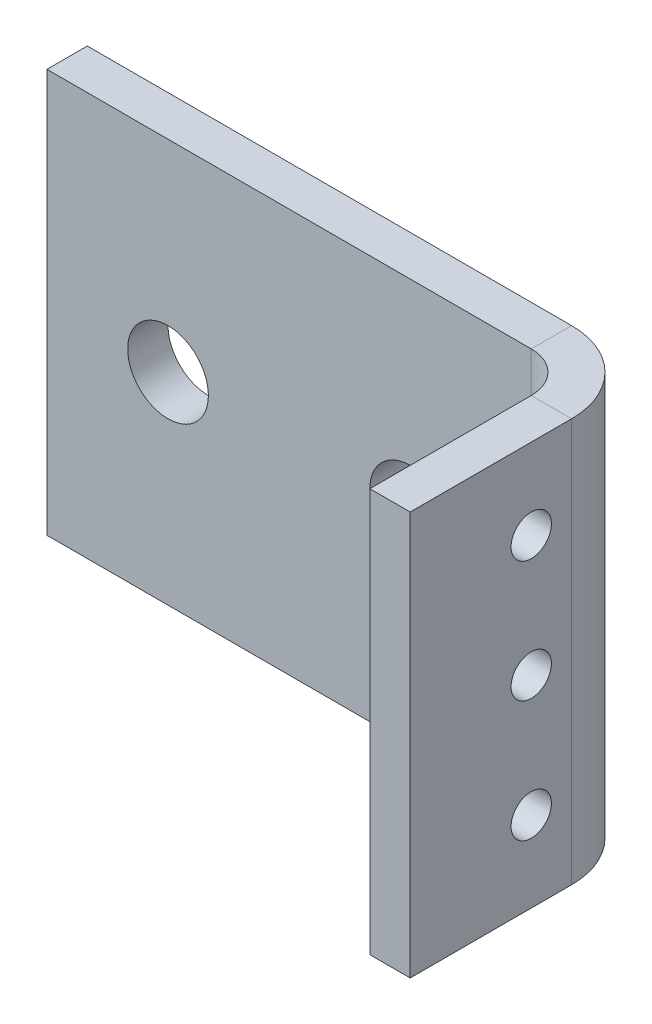
ISO-10303-21;
HEADER;
FILE_DESCRIPTION(('STEP AP214'),'2;1');
FILE_NAME('part.step','',(''),(''),'','','');
FILE_SCHEMA(('AUTOMOTIVE_DESIGN { 1 0 10303 214 1 1 1 1 }'));
ENDSEC;
DATA;
#1=APPLICATION_CONTEXT('core data for automotive mechanical design processes');
#2=APPLICATION_PROTOCOL_DEFINITION('international standard','automotive_design',2000,#1);
#3=PRODUCT_CONTEXT('',#1,'mechanical');
#4=PRODUCT('Part','Part','',(#3));
#5=PRODUCT_RELATED_PRODUCT_CATEGORY('part','',(#4));
#6=PRODUCT_DEFINITION_FORMATION('','',#4);
#7=PRODUCT_DEFINITION_CONTEXT('part definition',#1,'design');
#8=PRODUCT_DEFINITION('design','',#6,#7);
#9=PRODUCT_DEFINITION_SHAPE('','',#8);
#10=(LENGTH_UNIT() NAMED_UNIT(*) SI_UNIT(.MILLI.,.METRE.));
#11=(NAMED_UNIT(*) PLANE_ANGLE_UNIT() SI_UNIT($,.RADIAN.));
#12=(NAMED_UNIT(*) SI_UNIT($,.STERADIAN.) SOLID_ANGLE_UNIT());
#13=UNCERTAINTY_MEASURE_WITH_UNIT(LENGTH_MEASURE(1.E-05),#10,'distance_accuracy_value','');
#14=(GEOMETRIC_REPRESENTATION_CONTEXT(3) GLOBAL_UNCERTAINTY_ASSIGNED_CONTEXT((#13)) GLOBAL_UNIT_ASSIGNED_CONTEXT((#10,
#11,#12)) REPRESENTATION_CONTEXT('',''));
#15=CARTESIAN_POINT('',(0.,0.,0.));
#16=DIRECTION('',(0.,0.,1.));
#17=DIRECTION('',(1.,0.,0.));
#18=AXIS2_PLACEMENT_3D('',#15,#16,#17);
#19=CARTESIAN_POINT('',(-60.,-25.,-5.));
#20=DIRECTION('',(0.,-1.,0.));
#21=DIRECTION('',(0.,0.,-1.));
#22=AXIS2_PLACEMENT_3D('',#19,#20,#21);
#23=PLANE('',#22);
#24=DIRECTION('',(1.,0.,0.));
#25=VECTOR('',#24,1.);
#26=CARTESIAN_POINT('',(-60.,-25.,0.));
#27=LINE('',#26,#25);
#28=CARTESIAN_POINT('',(-60.,-25.,0.));
#29=VERTEX_POINT('',#28);
#30=CARTESIAN_POINT('',(0.,-25.,0.));
#31=VERTEX_POINT('',#30);
#32=EDGE_CURVE('E208',#29,#31,#27,.T.);
#33=ORIENTED_EDGE('',*,*,#32,.F.);
#34=DIRECTION('',(0.,0.,1.));
#35=VECTOR('',#34,1.);
#36=CARTESIAN_POINT('',(-60.,-25.,-5.));
#37=LINE('',#36,#35);
#38=CARTESIAN_POINT('',(-60.,-25.,-5.));
#39=VERTEX_POINT('',#38);
#40=EDGE_CURVE('E75',#39,#29,#37,.T.);
#41=ORIENTED_EDGE('',*,*,#40,.F.);
#42=DIRECTION('',(1.,0.,0.));
#43=VECTOR('',#42,1.);
#44=CARTESIAN_POINT('',(-60.,-25.,-5.));
#45=LINE('',#44,#43);
#46=CARTESIAN_POINT('',(0.,-25.,-5.));
#47=VERTEX_POINT('',#46);
#48=EDGE_CURVE('E213',#39,#47,#45,.T.);
#49=ORIENTED_EDGE('',*,*,#48,.T.);
#50=DIRECTION('',(0.,0.,1.));
#51=VECTOR('',#50,1.);
#52=CARTESIAN_POINT('',(0.,-25.,-5.));
#53=LINE('',#52,#51);
#54=EDGE_CURVE('E13',#47,#31,#53,.T.);
#55=ORIENTED_EDGE('',*,*,#54,.T.);
#56=EDGE_LOOP('',(#33,#41,#49,#55));
#57=FACE_BOUND('',#56,.T.);
#58=ADVANCED_FACE('F65',(#57),#23,.T.);
#59=CARTESIAN_POINT('',(-60.,25.,-5.));
#60=DIRECTION('',(-1.,0.,0.));
#61=DIRECTION('',(0.,-1.,0.));
#62=AXIS2_PLACEMENT_3D('',#59,#60,#61);
#63=PLANE('',#62);
#64=DIRECTION('',(0.,-1.,0.));
#65=VECTOR('',#64,1.);
#66=CARTESIAN_POINT('',(-60.,25.,0.));
#67=LINE('',#66,#65);
#68=CARTESIAN_POINT('',(-60.,25.,0.));
#69=VERTEX_POINT('',#68);
#70=EDGE_CURVE('E220',#69,#29,#67,.T.);
#71=ORIENTED_EDGE('',*,*,#70,.F.);
#72=DIRECTION('',(0.,0.,1.));
#73=VECTOR('',#72,1.);
#74=CARTESIAN_POINT('',(-60.,25.,-5.));
#75=LINE('',#74,#73);
#76=CARTESIAN_POINT('',(-60.,25.,-5.));
#77=VERTEX_POINT('',#76);
#78=EDGE_CURVE('E108',#77,#69,#75,.T.);
#79=ORIENTED_EDGE('',*,*,#78,.F.);
#80=DIRECTION('',(0.,-1.,0.));
#81=VECTOR('',#80,1.);
#82=CARTESIAN_POINT('',(-60.,25.,-5.));
#83=LINE('',#82,#81);
#84=EDGE_CURVE('E211',#77,#39,#83,.T.);
#85=ORIENTED_EDGE('',*,*,#84,.T.);
#86=ORIENTED_EDGE('',*,*,#40,.T.);
#87=EDGE_LOOP('',(#71,#79,#85,#86));
#88=FACE_BOUND('',#87,.T.);
#89=ADVANCED_FACE('F285',(#88),#63,.T.);
#90=CARTESIAN_POINT('',(-60.,25.,-5.));
#91=DIRECTION('',(0.,1.,0.));
#92=DIRECTION('',(-1.,0.,0.));
#93=AXIS2_PLACEMENT_3D('',#90,#91,#92);
#94=PLANE('',#93);
#95=DIRECTION('',(-1.,0.,0.));
#96=VECTOR('',#95,1.);
#97=CARTESIAN_POINT('',(-60.,25.,0.));
#98=LINE('',#97,#96);
#99=CARTESIAN_POINT('',(0.,25.,0.));
#100=VERTEX_POINT('',#99);
#101=EDGE_CURVE('E217',#100,#69,#98,.T.);
#102=ORIENTED_EDGE('',*,*,#101,.F.);
#103=DIRECTION('',(0.,0.,1.));
#104=VECTOR('',#103,1.);
#105=CARTESIAN_POINT('',(0.,25.,-5.));
#106=LINE('',#105,#104);
#107=CARTESIAN_POINT('',(0.,25.,-5.));
#108=VERTEX_POINT('',#107);
#109=EDGE_CURVE('E69',#108,#100,#106,.T.);
#110=ORIENTED_EDGE('',*,*,#109,.F.);
#111=DIRECTION('',(-1.,0.,0.));
#112=VECTOR('',#111,1.);
#113=CARTESIAN_POINT('',(-60.,25.,-5.));
#114=LINE('',#113,#112);
#115=EDGE_CURVE('E207',#108,#77,#114,.T.);
#116=ORIENTED_EDGE('',*,*,#115,.T.);
#117=ORIENTED_EDGE('',*,*,#78,.T.);
#118=EDGE_LOOP('',(#102,#110,#116,#117));
#119=FACE_BOUND('',#118,.T.);
#120=ADVANCED_FACE('F67',(#119),#94,.T.);
#121=CARTESIAN_POINT('',(0.,0.,-5.));
#122=DIRECTION('',(0.,0.,1.));
#123=DIRECTION('',(1.,0.,0.));
#124=AXIS2_PLACEMENT_3D('',#121,#122,#123);
#125=PLANE('',#124);
#126=CARTESIAN_POINT('',(-45.,0.,-5.));
#127=DIRECTION('',(0.,0.,1.));
#128=DIRECTION('',(1.,0.,0.));
#129=AXIS2_PLACEMENT_3D('',#126,#127,#128);
#130=CIRCLE('',#129,5.);
#131=CARTESIAN_POINT('',(-40.,0.,-5.));
#132=VERTEX_POINT('',#131);
#133=EDGE_CURVE('E194',#132,#132,#130,.T.);
#134=ORIENTED_EDGE('',*,*,#133,.T.);
#135=EDGE_LOOP('',(#134));
#136=FACE_BOUND('',#135,.T.);
#137=CARTESIAN_POINT('',(-15.,0.,-5.));
#138=DIRECTION('',(0.,0.,1.));
#139=DIRECTION('',(1.,0.,0.));
#140=AXIS2_PLACEMENT_3D('',#137,#138,#139);
#141=CIRCLE('',#140,5.);
#142=CARTESIAN_POINT('',(-10.,0.,-5.));
#143=VERTEX_POINT('',#142);
#144=EDGE_CURVE('E184',#143,#143,#141,.T.);
#145=ORIENTED_EDGE('',*,*,#144,.T.);
#146=EDGE_LOOP('',(#145));
#147=FACE_BOUND('',#146,.T.);
#148=DIRECTION('',(0.,1.,0.));
#149=VECTOR('',#148,1.);
#150=CARTESIAN_POINT('',(0.,25.,-5.));
#151=LINE('',#150,#149);
#152=EDGE_CURVE('E84',#47,#108,#151,.T.);
#153=ORIENTED_EDGE('',*,*,#152,.F.);
#154=ORIENTED_EDGE('',*,*,#48,.F.);
#155=ORIENTED_EDGE('',*,*,#84,.F.);
#156=ORIENTED_EDGE('',*,*,#115,.F.);
#157=EDGE_LOOP('',(#153,#154,#155,#156));
#158=FACE_BOUND('',#157,.T.);
#159=ADVANCED_FACE('F297',(#136,#147,#158),#125,.F.);
#160=CARTESIAN_POINT('',(0.,0.,0.));
#161=DIRECTION('',(0.,0.,1.));
#162=DIRECTION('',(1.,0.,0.));
#163=AXIS2_PLACEMENT_3D('',#160,#161,#162);
#164=PLANE('',#163);
#165=CARTESIAN_POINT('',(-45.,0.,0.));
#166=DIRECTION('',(0.,0.,1.));
#167=DIRECTION('',(1.,0.,0.));
#168=AXIS2_PLACEMENT_3D('',#165,#166,#167);
#169=CIRCLE('',#168,5.);
#170=CARTESIAN_POINT('',(-40.,0.,0.));
#171=VERTEX_POINT('',#170);
#172=EDGE_CURVE('E198',#171,#171,#169,.T.);
#173=ORIENTED_EDGE('',*,*,#172,.F.);
#174=EDGE_LOOP('',(#173));
#175=FACE_BOUND('',#174,.T.);
#176=CARTESIAN_POINT('',(-15.,0.,0.));
#177=DIRECTION('',(0.,0.,1.));
#178=DIRECTION('',(1.,0.,0.));
#179=AXIS2_PLACEMENT_3D('',#176,#177,#178);
#180=CIRCLE('',#179,5.);
#181=CARTESIAN_POINT('',(-10.,0.,0.));
#182=VERTEX_POINT('',#181);
#183=EDGE_CURVE('E201',#182,#182,#180,.T.);
#184=ORIENTED_EDGE('',*,*,#183,.F.);
#185=EDGE_LOOP('',(#184));
#186=FACE_BOUND('',#185,.T.);
#187=DIRECTION('',(0.,1.,0.));
#188=VECTOR('',#187,1.);
#189=CARTESIAN_POINT('',(0.,25.,0.));
#190=LINE('',#189,#188);
#191=EDGE_CURVE('E197',#31,#100,#190,.T.);
#192=ORIENTED_EDGE('',*,*,#191,.T.);
#193=ORIENTED_EDGE('',*,*,#101,.T.);
#194=ORIENTED_EDGE('',*,*,#70,.T.);
#195=ORIENTED_EDGE('',*,*,#32,.T.);
#196=EDGE_LOOP('',(#192,#193,#194,#195));
#197=FACE_BOUND('',#196,.T.);
#198=ADVANCED_FACE('F293',(#175,#186,#197),#164,.T.);
#199=CARTESIAN_POINT('',(-15.,0.,-5.));
#200=DIRECTION('',(0.,0.,1.));
#201=DIRECTION('',(1.,0.,0.));
#202=AXIS2_PLACEMENT_3D('',#199,#200,#201);
#203=CYLINDRICAL_SURFACE('',#202,5.);
#204=ORIENTED_EDGE('',*,*,#144,.F.);
#205=EDGE_LOOP('',(#204));
#206=FACE_BOUND('',#205,.T.);
#207=ORIENTED_EDGE('',*,*,#183,.T.);
#208=EDGE_LOOP('',(#207));
#209=FACE_BOUND('',#208,.T.);
#210=ADVANCED_FACE('F296',(#206,#209),#203,.F.);
#211=CARTESIAN_POINT('',(-45.,0.,-5.));
#212=DIRECTION('',(0.,0.,1.));
#213=DIRECTION('',(1.,0.,0.));
#214=AXIS2_PLACEMENT_3D('',#211,#212,#213);
#215=CYLINDRICAL_SURFACE('',#214,5.);
#216=ORIENTED_EDGE('',*,*,#133,.F.);
#217=EDGE_LOOP('',(#216));
#218=FACE_BOUND('',#217,.T.);
#219=ORIENTED_EDGE('',*,*,#172,.T.);
#220=EDGE_LOOP('',(#219));
#221=FACE_BOUND('',#220,.T.);
#222=ADVANCED_FACE('F304',(#218,#221),#215,.F.);
#223=CARTESIAN_POINT('',(0.,-25.,5.));
#224=DIRECTION('',(0.,-1.,0.));
#225=DIRECTION('',(1.,0.,0.));
#226=AXIS2_PLACEMENT_3D('',#223,#224,#225);
#227=PLANE('',#226);
#228=DIRECTION('',(-1.,0.,0.));
#229=VECTOR('',#228,1.);
#230=CARTESIAN_POINT('',(10.,-25.,4.99999999999997));
#231=LINE('',#230,#229);
#232=CARTESIAN_POINT('',(5.00000000000001,-25.,4.99999999999998));
#233=VERTEX_POINT('',#232);
#234=CARTESIAN_POINT('',(10.,-25.,4.99999999999997));
#235=VERTEX_POINT('',#234);
#236=EDGE_CURVE('E162',#233,#235,#231,.F.);
#237=ORIENTED_EDGE('',*,*,#236,.F.);
#238=CARTESIAN_POINT('',(0.,-25.,5.));
#239=DIRECTION('',(0.,1.,0.));
#240=DIRECTION('',(-1.,0.,0.));
#241=AXIS2_PLACEMENT_3D('',#238,#239,#240);
#242=CIRCLE('',#241,5.);
#243=EDGE_CURVE('E188',#31,#233,#242,.F.);
#244=ORIENTED_EDGE('',*,*,#243,.F.);
#245=ORIENTED_EDGE('',*,*,#54,.F.);
#246=CARTESIAN_POINT('',(0.,-25.,5.));
#247=DIRECTION('',(0.,1.,0.));
#248=DIRECTION('',(-1.,0.,0.));
#249=AXIS2_PLACEMENT_3D('',#246,#247,#248);
#250=CIRCLE('',#249,10.);
#251=EDGE_CURVE('E181',#47,#235,#250,.F.);
#252=ORIENTED_EDGE('',*,*,#251,.T.);
#253=EDGE_LOOP('',(#237,#244,#245,#252));
#254=FACE_BOUND('',#253,.T.);
#255=ADVANCED_FACE('F307',(#254),#227,.T.);
#256=CARTESIAN_POINT('',(0.,25.,5.));
#257=DIRECTION('',(0.,-1.,0.));
#258=DIRECTION('',(1.,0.,0.));
#259=AXIS2_PLACEMENT_3D('',#256,#257,#258);
#260=PLANE('',#259);
#261=CARTESIAN_POINT('',(0.,25.,5.));
#262=DIRECTION('',(0.,1.,0.));
#263=DIRECTION('',(-1.,0.,0.));
#264=AXIS2_PLACEMENT_3D('',#261,#262,#263);
#265=CIRCLE('',#264,5.);
#266=CARTESIAN_POINT('',(4.99999999999999,25.,4.99999999999998));
#267=VERTEX_POINT('',#266);
#268=EDGE_CURVE('E191',#267,#100,#265,.T.);
#269=ORIENTED_EDGE('',*,*,#268,.F.);
#270=DIRECTION('',(-1.,0.,0.));
#271=VECTOR('',#270,1.);
#272=CARTESIAN_POINT('',(4.99999999999999,25.,4.99999999999998));
#273=LINE('',#272,#271);
#274=CARTESIAN_POINT('',(9.99999999999999,25.,4.99999999999997));
#275=VERTEX_POINT('',#274);
#276=EDGE_CURVE('E174',#267,#275,#273,.F.);
#277=ORIENTED_EDGE('',*,*,#276,.T.);
#278=CARTESIAN_POINT('',(0.,25.,5.));
#279=DIRECTION('',(0.,1.,0.));
#280=DIRECTION('',(-1.,0.,0.));
#281=AXIS2_PLACEMENT_3D('',#278,#279,#280);
#282=CIRCLE('',#281,10.);
#283=EDGE_CURVE('E185',#275,#108,#282,.T.);
#284=ORIENTED_EDGE('',*,*,#283,.T.);
#285=ORIENTED_EDGE('',*,*,#109,.T.);
#286=EDGE_LOOP('',(#269,#277,#284,#285));
#287=FACE_BOUND('',#286,.T.);
#288=ADVANCED_FACE('F228',(#287),#260,.F.);
#289=CARTESIAN_POINT('',(0.,25.,5.));
#290=DIRECTION('',(0.,1.,0.));
#291=DIRECTION('',(1.,0.,0.));
#292=AXIS2_PLACEMENT_3D('',#289,#290,#291);
#293=CYLINDRICAL_SURFACE('',#292,10.);
#294=ORIENTED_EDGE('',*,*,#152,.T.);
#295=ORIENTED_EDGE('',*,*,#283,.F.);
#296=DIRECTION('',(0.,1.,0.));
#297=VECTOR('',#296,1.);
#298=CARTESIAN_POINT('',(10.,-25.,4.99999999999997));
#299=LINE('',#298,#297);
#300=EDGE_CURVE('E172',#275,#235,#299,.F.);
#301=ORIENTED_EDGE('',*,*,#300,.T.);
#302=ORIENTED_EDGE('',*,*,#251,.F.);
#303=EDGE_LOOP('',(#294,#295,#301,#302));
#304=FACE_BOUND('',#303,.T.);
#305=ADVANCED_FACE('F311',(#304),#293,.T.);
#306=CARTESIAN_POINT('',(0.,25.,5.));
#307=DIRECTION('',(0.,1.,0.));
#308=DIRECTION('',(1.,0.,0.));
#309=AXIS2_PLACEMENT_3D('',#306,#307,#308);
#310=CYLINDRICAL_SURFACE('',#309,5.);
#311=ORIENTED_EDGE('',*,*,#191,.F.);
#312=ORIENTED_EDGE('',*,*,#243,.T.);
#313=DIRECTION('',(0.,1.,0.));
#314=VECTOR('',#313,1.);
#315=CARTESIAN_POINT('',(5.00000000000001,-25.,4.99999999999998));
#316=LINE('',#315,#314);
#317=EDGE_CURVE('E177',#233,#267,#316,.T.);
#318=ORIENTED_EDGE('',*,*,#317,.T.);
#319=ORIENTED_EDGE('',*,*,#268,.T.);
#320=EDGE_LOOP('',(#311,#312,#318,#319));
#321=FACE_BOUND('',#320,.T.);
#322=ADVANCED_FACE('F232',(#321),#310,.F.);
#323=CARTESIAN_POINT('',(10.0000000000001,25.,25.));
#324=DIRECTION('',(0.,-1.,0.));
#325=DIRECTION('',(1.,0.,0.));
#326=AXIS2_PLACEMENT_3D('',#323,#324,#325);
#327=PLANE('',#326);
#328=ORIENTED_EDGE('',*,*,#276,.F.);
#329=DIRECTION('',(0.,0.,-1.));
#330=VECTOR('',#329,1.);
#331=CARTESIAN_POINT('',(5.00000000000006,25.,25.));
#332=LINE('',#331,#330);
#333=CARTESIAN_POINT('',(5.00000000000006,25.,25.));
#334=VERTEX_POINT('',#333);
#335=EDGE_CURVE('E170',#267,#334,#332,.F.);
#336=ORIENTED_EDGE('',*,*,#335,.T.);
#337=DIRECTION('',(-1.,0.,0.));
#338=VECTOR('',#337,1.);
#339=CARTESIAN_POINT('',(10.0000000000001,25.,25.));
#340=LINE('',#339,#338);
#341=CARTESIAN_POINT('',(10.0000000000001,25.,25.));
#342=VERTEX_POINT('',#341);
#343=EDGE_CURVE('E158',#342,#334,#340,.T.);
#344=ORIENTED_EDGE('',*,*,#343,.F.);
#345=DIRECTION('',(0.,0.,1.));
#346=VECTOR('',#345,1.);
#347=CARTESIAN_POINT('',(9.99999999999998,25.,0.));
#348=LINE('',#347,#346);
#349=EDGE_CURVE('E145',#275,#342,#348,.T.);
#350=ORIENTED_EDGE('',*,*,#349,.F.);
#351=EDGE_LOOP('',(#328,#336,#344,#350));
#352=FACE_BOUND('',#351,.T.);
#353=ADVANCED_FACE('F239',(#352),#327,.F.);
#354=CARTESIAN_POINT('',(9.99999999999999,-25.,0.));
#355=DIRECTION('',(0.,1.,0.));
#356=DIRECTION('',(-1.,0.,0.));
#357=AXIS2_PLACEMENT_3D('',#354,#355,#356);
#358=PLANE('',#357);
#359=ORIENTED_EDGE('',*,*,#236,.T.);
#360=DIRECTION('',(0.,0.,-1.));
#361=VECTOR('',#360,1.);
#362=CARTESIAN_POINT('',(9.99999999999999,-25.,0.));
#363=LINE('',#362,#361);
#364=CARTESIAN_POINT('',(10.0000000000001,-25.,25.));
#365=VERTEX_POINT('',#364);
#366=EDGE_CURVE('E143',#365,#235,#363,.T.);
#367=ORIENTED_EDGE('',*,*,#366,.F.);
#368=DIRECTION('',(-1.,0.,0.));
#369=VECTOR('',#368,1.);
#370=CARTESIAN_POINT('',(10.0000000000001,-25.,25.));
#371=LINE('',#370,#369);
#372=CARTESIAN_POINT('',(5.00000000000008,-25.,25.));
#373=VERTEX_POINT('',#372);
#374=EDGE_CURVE('E151',#365,#373,#371,.T.);
#375=ORIENTED_EDGE('',*,*,#374,.T.);
#376=DIRECTION('',(0.,0.,1.));
#377=VECTOR('',#376,1.);
#378=CARTESIAN_POINT('',(4.99999999999999,-25.,0.));
#379=LINE('',#378,#377);
#380=EDGE_CURVE('E167',#373,#233,#379,.F.);
#381=ORIENTED_EDGE('',*,*,#380,.T.);
#382=EDGE_LOOP('',(#359,#367,#375,#381));
#383=FACE_BOUND('',#382,.T.);
#384=ADVANCED_FACE('F161',(#383),#358,.F.);
#385=CARTESIAN_POINT('',(9.99999999999998,0.,0.));
#386=DIRECTION('',(-1.,0.,0.));
#387=DIRECTION('',(0.,0.,1.));
#388=AXIS2_PLACEMENT_3D('',#385,#386,#387);
#389=PLANE('',#388);
#390=CARTESIAN_POINT('',(10.,15.,10.));
#391=DIRECTION('',(-1.,0.,0.));
#392=DIRECTION('',(0.,0.,1.));
#393=AXIS2_PLACEMENT_3D('',#390,#391,#392);
#394=CIRCLE('',#393,2.5);
#395=CARTESIAN_POINT('',(10.,15.,12.5));
#396=VERTEX_POINT('',#395);
#397=EDGE_CURVE('E246',#396,#396,#394,.T.);
#398=ORIENTED_EDGE('',*,*,#397,.T.);
#399=EDGE_LOOP('',(#398));
#400=FACE_BOUND('',#399,.T.);
#401=CARTESIAN_POINT('',(10.,-15.,10.));
#402=DIRECTION('',(-1.,0.,0.));
#403=DIRECTION('',(0.,0.,1.));
#404=AXIS2_PLACEMENT_3D('',#401,#402,#403);
#405=CIRCLE('',#404,2.5);
#406=CARTESIAN_POINT('',(10.,-15.,12.5));
#407=VERTEX_POINT('',#406);
#408=EDGE_CURVE('E247',#407,#407,#405,.T.);
#409=ORIENTED_EDGE('',*,*,#408,.T.);
#410=EDGE_LOOP('',(#409));
#411=FACE_BOUND('',#410,.T.);
#412=CARTESIAN_POINT('',(10.,0.,10.));
#413=DIRECTION('',(-1.,0.,0.));
#414=DIRECTION('',(0.,0.,1.));
#415=AXIS2_PLACEMENT_3D('',#412,#413,#414);
#416=CIRCLE('',#415,2.5);
#417=CARTESIAN_POINT('',(10.,0.,12.5));
#418=VERTEX_POINT('',#417);
#419=EDGE_CURVE('E180',#418,#418,#416,.T.);
#420=ORIENTED_EDGE('',*,*,#419,.T.);
#421=EDGE_LOOP('',(#420));
#422=FACE_BOUND('',#421,.T.);
#423=ORIENTED_EDGE('',*,*,#300,.F.);
#424=ORIENTED_EDGE('',*,*,#349,.T.);
#425=DIRECTION('',(0.,-1.,0.));
#426=VECTOR('',#425,1.);
#427=CARTESIAN_POINT('',(10.0000000000001,0.,25.));
#428=LINE('',#427,#426);
#429=EDGE_CURVE('E138',#342,#365,#428,.T.);
#430=ORIENTED_EDGE('',*,*,#429,.T.);
#431=ORIENTED_EDGE('',*,*,#366,.T.);
#432=EDGE_LOOP('',(#423,#424,#430,#431));
#433=FACE_BOUND('',#432,.T.);
#434=ADVANCED_FACE('F141',(#400,#411,#422,#433),#389,.F.);
#435=CARTESIAN_POINT('',(4.99999999999998,0.,0.));
#436=DIRECTION('',(-1.,0.,0.));
#437=DIRECTION('',(0.,0.,1.));
#438=AXIS2_PLACEMENT_3D('',#435,#436,#437);
#439=PLANE('',#438);
#440=CARTESIAN_POINT('',(5.00000000000001,15.,10.));
#441=DIRECTION('',(-1.,0.,0.));
#442=DIRECTION('',(0.,0.,1.));
#443=AXIS2_PLACEMENT_3D('',#440,#441,#442);
#444=CIRCLE('',#443,2.5);
#445=CARTESIAN_POINT('',(5.00000000000002,15.,12.5));
#446=VERTEX_POINT('',#445);
#447=EDGE_CURVE('E250',#446,#446,#444,.T.);
#448=ORIENTED_EDGE('',*,*,#447,.F.);
#449=EDGE_LOOP('',(#448));
#450=FACE_BOUND('',#449,.T.);
#451=CARTESIAN_POINT('',(5.00000000000002,-15.,10.));
#452=DIRECTION('',(-1.,0.,0.));
#453=DIRECTION('',(0.,0.,1.));
#454=AXIS2_PLACEMENT_3D('',#451,#452,#453);
#455=CIRCLE('',#454,2.5);
#456=CARTESIAN_POINT('',(5.00000000000003,-15.,12.5));
#457=VERTEX_POINT('',#456);
#458=EDGE_CURVE('E251',#457,#457,#455,.T.);
#459=ORIENTED_EDGE('',*,*,#458,.F.);
#460=EDGE_LOOP('',(#459));
#461=FACE_BOUND('',#460,.T.);
#462=CARTESIAN_POINT('',(5.00000000000002,0.,10.));
#463=DIRECTION('',(-1.,0.,0.));
#464=DIRECTION('',(0.,0.,1.));
#465=AXIS2_PLACEMENT_3D('',#462,#463,#464);
#466=CIRCLE('',#465,2.5);
#467=CARTESIAN_POINT('',(5.00000000000003,0.,12.5));
#468=VERTEX_POINT('',#467);
#469=EDGE_CURVE('E243',#468,#468,#466,.T.);
#470=ORIENTED_EDGE('',*,*,#469,.F.);
#471=EDGE_LOOP('',(#470));
#472=FACE_BOUND('',#471,.T.);
#473=ORIENTED_EDGE('',*,*,#335,.F.);
#474=ORIENTED_EDGE('',*,*,#317,.F.);
#475=ORIENTED_EDGE('',*,*,#380,.F.);
#476=DIRECTION('',(0.,1.,0.));
#477=VECTOR('',#476,1.);
#478=CARTESIAN_POINT('',(5.00000000000008,-25.,25.));
#479=LINE('',#478,#477);
#480=EDGE_CURVE('E154',#334,#373,#479,.F.);
#481=ORIENTED_EDGE('',*,*,#480,.F.);
#482=EDGE_LOOP('',(#473,#474,#475,#481));
#483=FACE_BOUND('',#482,.T.);
#484=ADVANCED_FACE('F237',(#450,#461,#472,#483),#439,.T.);
#485=CARTESIAN_POINT('',(10.0000000000001,-25.,25.));
#486=DIRECTION('',(0.,0.,-1.));
#487=DIRECTION('',(-1.,0.,0.));
#488=AXIS2_PLACEMENT_3D('',#485,#486,#487);
#489=PLANE('',#488);
#490=ORIENTED_EDGE('',*,*,#480,.T.);
#491=ORIENTED_EDGE('',*,*,#374,.F.);
#492=ORIENTED_EDGE('',*,*,#429,.F.);
#493=ORIENTED_EDGE('',*,*,#343,.T.);
#494=EDGE_LOOP('',(#490,#491,#492,#493));
#495=FACE_BOUND('',#494,.T.);
#496=ADVANCED_FACE('F152',(#495),#489,.F.);
#497=CARTESIAN_POINT('',(15.,0.,9.99999999999998));
#498=DIRECTION('',(-1.,0.,0.));
#499=DIRECTION('',(0.,0.,1.));
#500=AXIS2_PLACEMENT_3D('',#497,#498,#499);
#501=CYLINDRICAL_SURFACE('',#500,2.5);
#502=ORIENTED_EDGE('',*,*,#469,.T.);
#503=EDGE_LOOP('',(#502));
#504=FACE_BOUND('',#503,.T.);
#505=ORIENTED_EDGE('',*,*,#419,.F.);
#506=EDGE_LOOP('',(#505));
#507=FACE_BOUND('',#506,.T.);
#508=ADVANCED_FACE('F269',(#504,#507),#501,.F.);
#509=CARTESIAN_POINT('',(15.,-15.,9.99999999999998));
#510=DIRECTION('',(-1.,0.,0.));
#511=DIRECTION('',(0.,0.,1.));
#512=AXIS2_PLACEMENT_3D('',#509,#510,#511);
#513=CYLINDRICAL_SURFACE('',#512,2.5);
#514=ORIENTED_EDGE('',*,*,#458,.T.);
#515=EDGE_LOOP('',(#514));
#516=FACE_BOUND('',#515,.T.);
#517=ORIENTED_EDGE('',*,*,#408,.F.);
#518=EDGE_LOOP('',(#517));
#519=FACE_BOUND('',#518,.T.);
#520=ADVANCED_FACE('F272',(#516,#519),#513,.F.);
#521=CARTESIAN_POINT('',(15.,15.,9.99999999999998));
#522=DIRECTION('',(-1.,0.,0.));
#523=DIRECTION('',(0.,0.,1.));
#524=AXIS2_PLACEMENT_3D('',#521,#522,#523);
#525=CYLINDRICAL_SURFACE('',#524,2.5);
#526=ORIENTED_EDGE('',*,*,#447,.T.);
#527=EDGE_LOOP('',(#526));
#528=FACE_BOUND('',#527,.T.);
#529=ORIENTED_EDGE('',*,*,#397,.F.);
#530=EDGE_LOOP('',(#529));
#531=FACE_BOUND('',#530,.T.);
#532=ADVANCED_FACE('F259',(#528,#531),#525,.F.);
#533=CLOSED_SHELL('',(#58,#89,#120,#159,#198,#210,#222,#255,#288,#305,#322,#353,#384,#434,#484,
#496,#508,#520,#532));
#534=MANIFOLD_SOLID_BREP('B2',#533);
#535=ADVANCED_BREP_SHAPE_REPRESENTATION('',(#18,#534),#14);
#536=SHAPE_DEFINITION_REPRESENTATION(#9,#535);
ENDSEC;
END-ISO-10303-21;
